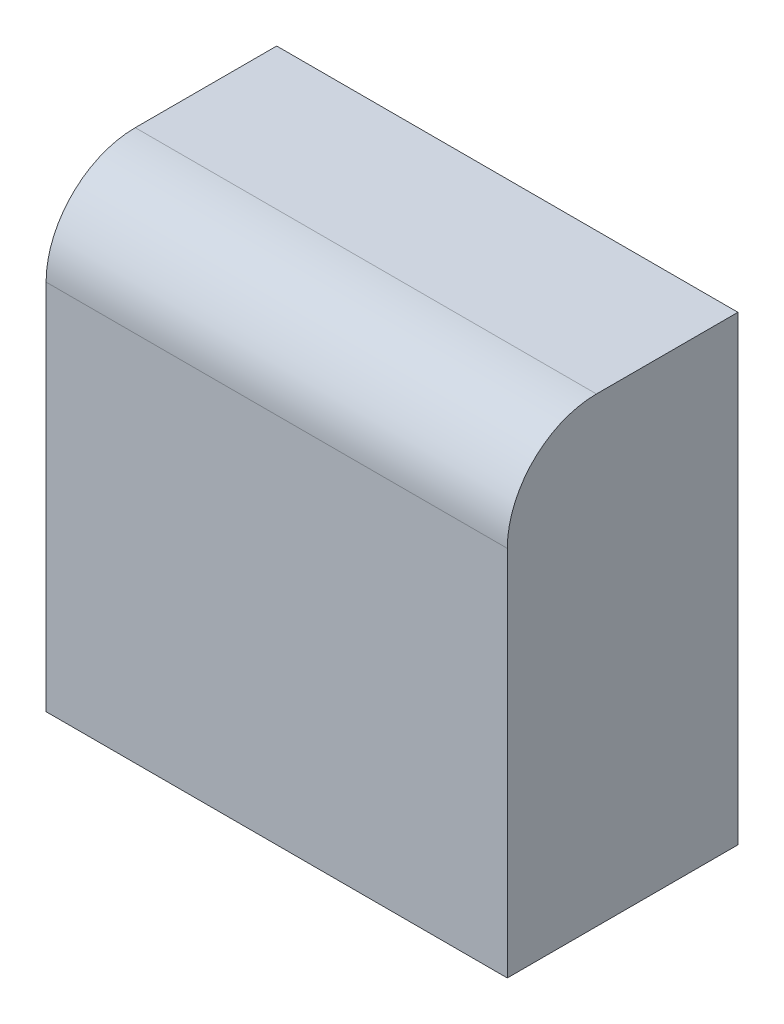
ISO-10303-21;
HEADER;
FILE_DESCRIPTION(('STEP AP214'),'2;1');
FILE_NAME('part.step','',(''),(''),'','','');
FILE_SCHEMA(('AUTOMOTIVE_DESIGN { 1 0 10303 214 1 1 1 1 }'));
ENDSEC;
DATA;
#1=APPLICATION_CONTEXT('core data for automotive mechanical design processes');
#2=APPLICATION_PROTOCOL_DEFINITION('international standard','automotive_design',2000,#1);
#3=PRODUCT_CONTEXT('',#1,'mechanical');
#4=PRODUCT('Part','Part','',(#3));
#5=PRODUCT_RELATED_PRODUCT_CATEGORY('part','',(#4));
#6=PRODUCT_DEFINITION_FORMATION('','',#4);
#7=PRODUCT_DEFINITION_CONTEXT('part definition',#1,'design');
#8=PRODUCT_DEFINITION('design','',#6,#7);
#9=PRODUCT_DEFINITION_SHAPE('','',#8);
#10=(LENGTH_UNIT() NAMED_UNIT(*) SI_UNIT(.MILLI.,.METRE.));
#11=(NAMED_UNIT(*) PLANE_ANGLE_UNIT() SI_UNIT($,.RADIAN.));
#12=(NAMED_UNIT(*) SI_UNIT($,.STERADIAN.) SOLID_ANGLE_UNIT());
#13=UNCERTAINTY_MEASURE_WITH_UNIT(LENGTH_MEASURE(1.E-05),#10,'distance_accuracy_value','');
#14=(GEOMETRIC_REPRESENTATION_CONTEXT(3) GLOBAL_UNCERTAINTY_ASSIGNED_CONTEXT((#13)) GLOBAL_UNIT_ASSIGNED_CONTEXT((#10,
#11,#12)) REPRESENTATION_CONTEXT('',''));
#15=CARTESIAN_POINT('',(0.,0.,0.));
#16=DIRECTION('',(0.,0.,1.));
#17=DIRECTION('',(1.,0.,0.));
#18=AXIS2_PLACEMENT_3D('',#15,#16,#17);
#19=CARTESIAN_POINT('',(-7.76,7.76,7.76));
#20=DIRECTION('',(1.,0.,0.));
#21=DIRECTION('',(0.,1.,0.));
#22=AXIS2_PLACEMENT_3D('',#19,#20,#21);
#23=PLANE('',#22);
#24=DIRECTION('',(0.,-1.,0.));
#25=VECTOR('',#24,1.);
#26=CARTESIAN_POINT('',(-7.76,7.76,7.76));
#27=LINE('',#26,#25);
#28=CARTESIAN_POINT('',(-7.76,4.76,7.76));
#29=VERTEX_POINT('',#28);
#30=CARTESIAN_POINT('',(-7.75999999999999,-7.76,7.76));
#31=VERTEX_POINT('',#30);
#32=EDGE_CURVE('E75',#29,#31,#27,.T.);
#33=ORIENTED_EDGE('',*,*,#32,.F.);
#34=CARTESIAN_POINT('',(-7.76,4.76,4.76));
#35=DIRECTION('',(1.,0.,0.));
#36=DIRECTION('',(0.,1.,0.));
#37=AXIS2_PLACEMENT_3D('',#34,#35,#36);
#38=CIRCLE('',#37,3.);
#39=CARTESIAN_POINT('',(-7.76,7.76,4.76));
#40=VERTEX_POINT('',#39);
#41=EDGE_CURVE('E53',#29,#40,#38,.F.);
#42=ORIENTED_EDGE('',*,*,#41,.T.);
#43=DIRECTION('',(0.,0.,-1.));
#44=VECTOR('',#43,1.);
#45=CARTESIAN_POINT('',(-7.76,7.76,7.76));
#46=LINE('',#45,#44);
#47=CARTESIAN_POINT('',(-7.76,7.76,0.));
#48=VERTEX_POINT('',#47);
#49=EDGE_CURVE('E105',#40,#48,#46,.T.);
#50=ORIENTED_EDGE('',*,*,#49,.T.);
#51=DIRECTION('',(0.,-1.,0.));
#52=VECTOR('',#51,1.);
#53=CARTESIAN_POINT('',(-7.76,7.76,0.));
#54=LINE('',#53,#52);
#55=CARTESIAN_POINT('',(-7.75999999999999,-7.76,0.));
#56=VERTEX_POINT('',#55);
#57=EDGE_CURVE('E97',#48,#56,#54,.T.);
#58=ORIENTED_EDGE('',*,*,#57,.T.);
#59=DIRECTION('',(0.,0.,-1.));
#60=VECTOR('',#59,1.);
#61=CARTESIAN_POINT('',(-7.75999999999999,-7.76,7.76));
#62=LINE('',#61,#60);
#63=EDGE_CURVE('E89',#31,#56,#62,.T.);
#64=ORIENTED_EDGE('',*,*,#63,.F.);
#65=EDGE_LOOP('',(#33,#42,#50,#58,#64));
#66=FACE_BOUND('',#65,.T.);
#67=ADVANCED_FACE('F31',(#66),#23,.F.);
#68=CARTESIAN_POINT('',(7.76000000000001,-7.76,7.76));
#69=DIRECTION('',(0.,1.,0.));
#70=DIRECTION('',(0.,0.,1.));
#71=AXIS2_PLACEMENT_3D('',#68,#69,#70);
#72=PLANE('',#71);
#73=DIRECTION('',(1.,0.,0.));
#74=VECTOR('',#73,1.);
#75=CARTESIAN_POINT('',(7.76000000000001,-7.76,0.));
#76=LINE('',#75,#74);
#77=CARTESIAN_POINT('',(7.76000000000001,-7.76,0.));
#78=VERTEX_POINT('',#77);
#79=EDGE_CURVE('E112',#56,#78,#76,.T.);
#80=ORIENTED_EDGE('',*,*,#79,.T.);
#81=DIRECTION('',(0.,0.,-1.));
#82=VECTOR('',#81,1.);
#83=CARTESIAN_POINT('',(7.76000000000001,-7.76,7.76));
#84=LINE('',#83,#82);
#85=CARTESIAN_POINT('',(7.76000000000001,-7.76,7.76));
#86=VERTEX_POINT('',#85);
#87=EDGE_CURVE('E92',#86,#78,#84,.T.);
#88=ORIENTED_EDGE('',*,*,#87,.F.);
#89=DIRECTION('',(1.,0.,0.));
#90=VECTOR('',#89,1.);
#91=CARTESIAN_POINT('',(7.76000000000001,-7.76,7.76));
#92=LINE('',#91,#90);
#93=EDGE_CURVE('E79',#31,#86,#92,.T.);
#94=ORIENTED_EDGE('',*,*,#93,.F.);
#95=ORIENTED_EDGE('',*,*,#63,.T.);
#96=EDGE_LOOP('',(#80,#88,#94,#95));
#97=FACE_BOUND('',#96,.T.);
#98=ADVANCED_FACE('F88',(#97),#72,.F.);
#99=CARTESIAN_POINT('',(7.76,7.76,7.76));
#100=DIRECTION('',(-1.,0.,0.));
#101=DIRECTION('',(0.,-1.,0.));
#102=AXIS2_PLACEMENT_3D('',#99,#100,#101);
#103=PLANE('',#102);
#104=DIRECTION('',(0.,0.,-1.));
#105=VECTOR('',#104,1.);
#106=CARTESIAN_POINT('',(7.76,7.76,7.76));
#107=LINE('',#106,#105);
#108=CARTESIAN_POINT('',(7.76,7.76,4.76));
#109=VERTEX_POINT('',#108);
#110=CARTESIAN_POINT('',(7.76,7.76,0.));
#111=VERTEX_POINT('',#110);
#112=EDGE_CURVE('E100',#109,#111,#107,.T.);
#113=ORIENTED_EDGE('',*,*,#112,.F.);
#114=CARTESIAN_POINT('',(7.76,4.76,4.76));
#115=DIRECTION('',(-1.,0.,0.));
#116=DIRECTION('',(0.,-1.,0.));
#117=AXIS2_PLACEMENT_3D('',#114,#115,#116);
#118=CIRCLE('',#117,3.);
#119=CARTESIAN_POINT('',(7.76,4.76,7.76));
#120=VERTEX_POINT('',#119);
#121=EDGE_CURVE('E11',#109,#120,#118,.F.);
#122=ORIENTED_EDGE('',*,*,#121,.T.);
#123=DIRECTION('',(0.,1.,0.));
#124=VECTOR('',#123,1.);
#125=CARTESIAN_POINT('',(7.76,7.76,7.76));
#126=LINE('',#125,#124);
#127=EDGE_CURVE('E94',#86,#120,#126,.T.);
#128=ORIENTED_EDGE('',*,*,#127,.F.);
#129=ORIENTED_EDGE('',*,*,#87,.T.);
#130=DIRECTION('',(0.,1.,0.));
#131=VECTOR('',#130,1.);
#132=CARTESIAN_POINT('',(7.76,7.76,0.));
#133=LINE('',#132,#131);
#134=EDGE_CURVE('E109',#78,#111,#133,.T.);
#135=ORIENTED_EDGE('',*,*,#134,.T.);
#136=EDGE_LOOP('',(#113,#122,#128,#129,#135));
#137=FACE_BOUND('',#136,.T.);
#138=ADVANCED_FACE('F118',(#137),#103,.F.);
#139=CARTESIAN_POINT('',(7.76,7.76,7.76));
#140=DIRECTION('',(0.,-1.,0.));
#141=DIRECTION('',(0.,0.,-1.));
#142=AXIS2_PLACEMENT_3D('',#139,#140,#141);
#143=PLANE('',#142);
#144=ORIENTED_EDGE('',*,*,#49,.F.);
#145=DIRECTION('',(-1.,0.,0.));
#146=VECTOR('',#145,1.);
#147=CARTESIAN_POINT('',(7.76,7.76,4.76));
#148=LINE('',#147,#146);
#149=EDGE_CURVE('E39',#40,#109,#148,.F.);
#150=ORIENTED_EDGE('',*,*,#149,.T.);
#151=ORIENTED_EDGE('',*,*,#112,.T.);
#152=DIRECTION('',(-1.,0.,0.));
#153=VECTOR('',#152,1.);
#154=CARTESIAN_POINT('',(7.76,7.76,0.));
#155=LINE('',#154,#153);
#156=EDGE_CURVE('E84',#111,#48,#155,.T.);
#157=ORIENTED_EDGE('',*,*,#156,.T.);
#158=EDGE_LOOP('',(#144,#150,#151,#157));
#159=FACE_BOUND('',#158,.T.);
#160=ADVANCED_FACE('F121',(#159),#143,.F.);
#161=CARTESIAN_POINT('',(-7.75999999999999,-7.76,7.76));
#162=DIRECTION('',(0.,0.,-1.));
#163=DIRECTION('',(-1.,0.,0.));
#164=AXIS2_PLACEMENT_3D('',#161,#162,#163);
#165=PLANE('',#164);
#166=ORIENTED_EDGE('',*,*,#127,.T.);
#167=DIRECTION('',(-1.,0.,0.));
#168=VECTOR('',#167,1.);
#169=CARTESIAN_POINT('',(-7.75999999999999,4.76,7.76));
#170=LINE('',#169,#168);
#171=EDGE_CURVE('E82',#120,#29,#170,.T.);
#172=ORIENTED_EDGE('',*,*,#171,.T.);
#173=ORIENTED_EDGE('',*,*,#32,.T.);
#174=ORIENTED_EDGE('',*,*,#93,.T.);
#175=EDGE_LOOP('',(#166,#172,#173,#174));
#176=FACE_BOUND('',#175,.T.);
#177=ADVANCED_FACE('F78',(#176),#165,.F.);
#178=CARTESIAN_POINT('',(-7.75999999999999,-7.76,0.));
#179=DIRECTION('',(0.,0.,-1.));
#180=DIRECTION('',(-1.,0.,0.));
#181=AXIS2_PLACEMENT_3D('',#178,#179,#180);
#182=PLANE('',#181);
#183=ORIENTED_EDGE('',*,*,#57,.F.);
#184=ORIENTED_EDGE('',*,*,#156,.F.);
#185=ORIENTED_EDGE('',*,*,#134,.F.);
#186=ORIENTED_EDGE('',*,*,#79,.F.);
#187=EDGE_LOOP('',(#183,#184,#185,#186));
#188=FACE_BOUND('',#187,.T.);
#189=ADVANCED_FACE('F123',(#188),#182,.T.);
#190=CARTESIAN_POINT('',(-7.75999999999999,4.76,4.76));
#191=DIRECTION('',(-1.,0.,0.));
#192=DIRECTION('',(0.,0.,1.));
#193=AXIS2_PLACEMENT_3D('',#190,#191,#192);
#194=CYLINDRICAL_SURFACE('',#193,3.);
#195=ORIENTED_EDGE('',*,*,#121,.F.);
#196=ORIENTED_EDGE('',*,*,#149,.F.);
#197=ORIENTED_EDGE('',*,*,#41,.F.);
#198=ORIENTED_EDGE('',*,*,#171,.F.);
#199=EDGE_LOOP('',(#195,#196,#197,#198));
#200=FACE_BOUND('',#199,.T.);
#201=ADVANCED_FACE('F33',(#200),#194,.T.);
#202=CLOSED_SHELL('',(#67,#98,#138,#160,#177,#189,#201));
#203=MANIFOLD_SOLID_BREP('B2',#202);
#204=ADVANCED_BREP_SHAPE_REPRESENTATION('',(#18,#203),#14);
#205=SHAPE_DEFINITION_REPRESENTATION(#9,#204);
ENDSEC;
END-ISO-10303-21;
